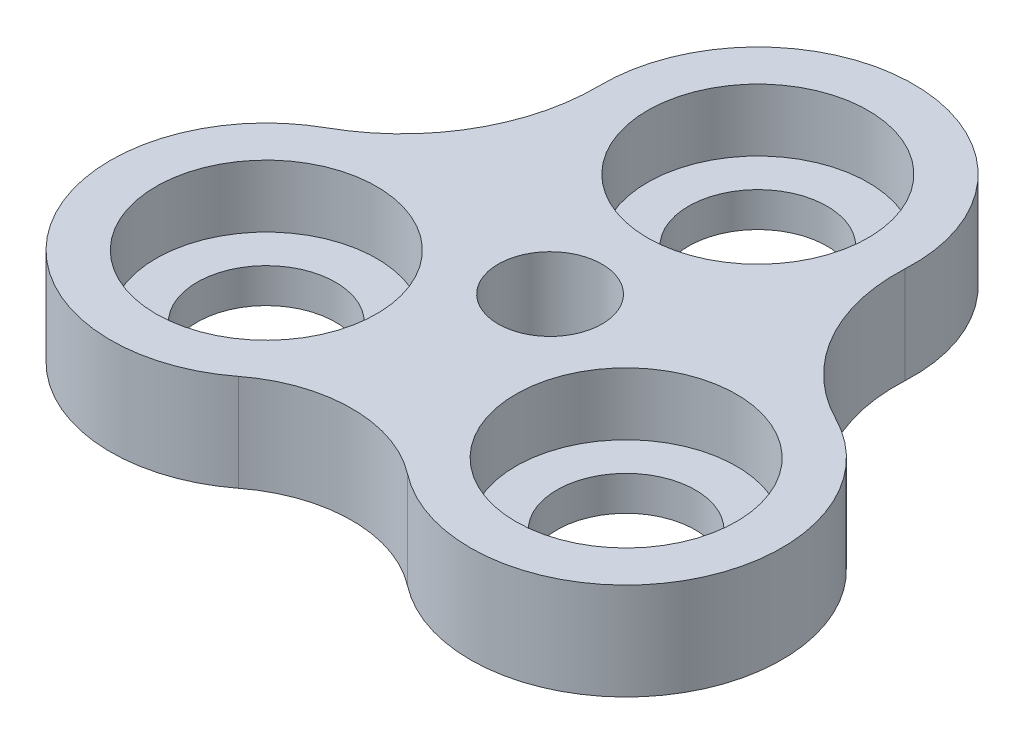
ISO-10303-21;
HEADER;
FILE_DESCRIPTION(('STEP AP214'),'2;1');
FILE_NAME('part.step','',(''),(''),'','','');
FILE_SCHEMA(('AUTOMOTIVE_DESIGN { 1 0 10303 214 1 1 1 1 }'));
ENDSEC;
DATA;
#1=APPLICATION_CONTEXT('core data for automotive mechanical design processes');
#2=APPLICATION_PROTOCOL_DEFINITION('international standard','automotive_design',2000,#1);
#3=PRODUCT_CONTEXT('',#1,'mechanical');
#4=PRODUCT('Part','Part','',(#3));
#5=PRODUCT_RELATED_PRODUCT_CATEGORY('part','',(#4));
#6=PRODUCT_DEFINITION_FORMATION('','',#4);
#7=PRODUCT_DEFINITION_CONTEXT('part definition',#1,'design');
#8=PRODUCT_DEFINITION('design','',#6,#7);
#9=PRODUCT_DEFINITION_SHAPE('','',#8);
#10=(LENGTH_UNIT() NAMED_UNIT(*) SI_UNIT(.MILLI.,.METRE.));
#11=(NAMED_UNIT(*) PLANE_ANGLE_UNIT() SI_UNIT($,.RADIAN.));
#12=(NAMED_UNIT(*) SI_UNIT($,.STERADIAN.) SOLID_ANGLE_UNIT());
#13=UNCERTAINTY_MEASURE_WITH_UNIT(LENGTH_MEASURE(1.E-05),#10,'distance_accuracy_value','');
#14=(GEOMETRIC_REPRESENTATION_CONTEXT(3) GLOBAL_UNCERTAINTY_ASSIGNED_CONTEXT((#13)) GLOBAL_UNIT_ASSIGNED_CONTEXT((#10,
#11,#12)) REPRESENTATION_CONTEXT('',''));
#15=CARTESIAN_POINT('',(0.,0.,0.));
#16=DIRECTION('',(0.,0.,1.));
#17=DIRECTION('',(1.,0.,0.));
#18=AXIS2_PLACEMENT_3D('',#15,#16,#17);
#19=CARTESIAN_POINT('',(-10.3923048454133,5.6,6.00000000000001));
#20=DIRECTION('',(0.,-1.,0.));
#21=DIRECTION('',(0.,0.,-1.));
#22=AXIS2_PLACEMENT_3D('',#19,#20,#21);
#23=CYLINDRICAL_SURFACE('',#22,9.);
#24=CARTESIAN_POINT('',(-10.3923048454133,0.,6.00000000000001));
#25=DIRECTION('',(0.,1.,0.));
#26=DIRECTION('',(0.,0.,1.));
#27=AXIS2_PLACEMENT_3D('',#24,#25,#26);
#28=CIRCLE('',#27,9.);
#29=CARTESIAN_POINT('',(-14.7758891564992,0.,-1.86029188946573));
#30=VERTEX_POINT('',#29);
#31=CARTESIAN_POINT('',(-4.88334112766204,0.,13.116973988747));
#32=VERTEX_POINT('',#31);
#33=EDGE_CURVE('E124',#30,#32,#28,.T.);
#34=ORIENTED_EDGE('',*,*,#33,.T.);
#35=DIRECTION('',(0.,-1.,0.));
#36=VECTOR('',#35,1.);
#37=CARTESIAN_POINT('',(-4.88334112766204,5.6,13.116973988747));
#38=LINE('',#37,#36);
#39=CARTESIAN_POINT('',(-4.88334112766204,5.6,13.116973988747));
#40=VERTEX_POINT('',#39);
#41=EDGE_CURVE('E11',#40,#32,#38,.T.);
#42=ORIENTED_EDGE('',*,*,#41,.F.);
#43=CARTESIAN_POINT('',(-10.3923048454133,5.6,6.00000000000001));
#44=DIRECTION('',(0.,1.,0.));
#45=DIRECTION('',(0.,0.,1.));
#46=AXIS2_PLACEMENT_3D('',#43,#44,#45);
#47=CIRCLE('',#46,9.);
#48=CARTESIAN_POINT('',(-14.7758891564992,5.6,-1.86029188946573));
#49=VERTEX_POINT('',#48);
#50=EDGE_CURVE('E331',#49,#40,#47,.T.);
#51=ORIENTED_EDGE('',*,*,#50,.F.);
#52=DIRECTION('',(0.,-1.,0.));
#53=VECTOR('',#52,1.);
#54=CARTESIAN_POINT('',(-14.7758891564992,5.6,-1.86029188946573));
#55=LINE('',#54,#53);
#56=EDGE_CURVE('E52',#49,#30,#55,.T.);
#57=ORIENTED_EDGE('',*,*,#56,.T.);
#58=EDGE_LOOP('',(#34,#42,#51,#57));
#59=FACE_BOUND('',#58,.T.);
#60=ADVANCED_FACE('F35',(#59),#23,.T.);
#61=CARTESIAN_POINT('',(0.,5.6,19.4257125400213));
#62=DIRECTION('',(0.,-1.,0.));
#63=DIRECTION('',(0.,0.,-1.));
#64=AXIS2_PLACEMENT_3D('',#61,#62,#63);
#65=CYLINDRICAL_SURFACE('',#64,7.97791969610194);
#66=CARTESIAN_POINT('',(0.,0.,19.4257125400213));
#67=DIRECTION('',(0.,1.,0.));
#68=DIRECTION('',(0.,0.,1.));
#69=AXIS2_PLACEMENT_3D('',#66,#67,#68);
#70=CIRCLE('',#69,7.97791969610194);
#71=CARTESIAN_POINT('',(4.88334112766205,0.,13.1169739887469));
#72=VERTEX_POINT('',#71);
#73=EDGE_CURVE('E127',#32,#72,#70,.F.);
#74=ORIENTED_EDGE('',*,*,#73,.T.);
#75=DIRECTION('',(0.,-1.,0.));
#76=VECTOR('',#75,1.);
#77=CARTESIAN_POINT('',(4.88334112766205,5.6,13.1169739887469));
#78=LINE('',#77,#76);
#79=CARTESIAN_POINT('',(4.88334112766205,5.6,13.1169739887469));
#80=VERTEX_POINT('',#79);
#81=EDGE_CURVE('E44',#80,#72,#78,.T.);
#82=ORIENTED_EDGE('',*,*,#81,.F.);
#83=CARTESIAN_POINT('',(0.,5.6,19.4257125400213));
#84=DIRECTION('',(0.,1.,0.));
#85=DIRECTION('',(0.,0.,1.));
#86=AXIS2_PLACEMENT_3D('',#83,#84,#85);
#87=CIRCLE('',#86,7.97791969610194);
#88=EDGE_CURVE('E85',#40,#80,#87,.F.);
#89=ORIENTED_EDGE('',*,*,#88,.F.);
#90=ORIENTED_EDGE('',*,*,#41,.T.);
#91=EDGE_LOOP('',(#74,#82,#89,#90));
#92=FACE_BOUND('',#91,.T.);
#93=ADVANCED_FACE('F160',(#92),#65,.F.);
#94=CARTESIAN_POINT('',(10.3923048454133,5.6,6.));
#95=DIRECTION('',(0.,-1.,0.));
#96=DIRECTION('',(0.,0.,-1.));
#97=AXIS2_PLACEMENT_3D('',#94,#95,#96);
#98=CYLINDRICAL_SURFACE('',#97,9.);
#99=CARTESIAN_POINT('',(10.3923048454133,0.,6.));
#100=DIRECTION('',(0.,1.,0.));
#101=DIRECTION('',(0.,0.,1.));
#102=AXIS2_PLACEMENT_3D('',#99,#100,#101);
#103=CIRCLE('',#102,9.);
#104=CARTESIAN_POINT('',(14.4775848258601,0.,-2.01938198874204));
#105=VERTEX_POINT('',#104);
#106=EDGE_CURVE('E129',#72,#105,#103,.T.);
#107=ORIENTED_EDGE('',*,*,#106,.T.);
#108=DIRECTION('',(0.,-1.,0.));
#109=VECTOR('',#108,1.);
#110=CARTESIAN_POINT('',(14.4775848258601,5.6,-2.01938198874204));
#111=LINE('',#110,#109);
#112=CARTESIAN_POINT('',(14.4775848258601,5.6,-2.01938198874204));
#113=VERTEX_POINT('',#112);
#114=EDGE_CURVE('E104',#113,#105,#111,.T.);
#115=ORIENTED_EDGE('',*,*,#114,.F.);
#116=CARTESIAN_POINT('',(10.3923048454133,5.6,6.));
#117=DIRECTION('',(0.,1.,0.));
#118=DIRECTION('',(0.,0.,1.));
#119=AXIS2_PLACEMENT_3D('',#116,#117,#118);
#120=CIRCLE('',#119,9.);
#121=EDGE_CURVE('E114',#80,#113,#120,.T.);
#122=ORIENTED_EDGE('',*,*,#121,.F.);
#123=ORIENTED_EDGE('',*,*,#81,.T.);
#124=EDGE_LOOP('',(#107,#115,#122,#123));
#125=FACE_BOUND('',#124,.T.);
#126=ADVANCED_FACE('F144',(#125),#98,.T.);
#127=CARTESIAN_POINT('',(19.0525366986451,5.6,-10.999987191708));
#128=DIRECTION('',(0.,-1.,0.));
#129=DIRECTION('',(0.,0.,-1.));
#130=AXIS2_PLACEMENT_3D('',#127,#128,#129);
#131=CYLINDRICAL_SURFACE('',#130,10.0787625455627);
#132=CARTESIAN_POINT('',(19.0525366986451,0.,-10.999987191708));
#133=DIRECTION('',(0.,1.,0.));
#134=DIRECTION('',(0.,0.,1.));
#135=AXIS2_PLACEMENT_3D('',#132,#133,#134);
#136=CIRCLE('',#135,10.0787625455627);
#137=CARTESIAN_POINT('',(8.9876285151254,0.,-11.5282652502679));
#138=VERTEX_POINT('',#137);
#139=EDGE_CURVE('E101',#138,#105,#136,.T.);
#140=ORIENTED_EDGE('',*,*,#139,.F.);
#141=DIRECTION('',(0.,-1.,0.));
#142=VECTOR('',#141,1.);
#143=CARTESIAN_POINT('',(8.9876285151254,5.6,-11.5282652502679));
#144=LINE('',#143,#142);
#145=CARTESIAN_POINT('',(8.9876285151254,5.6,-11.5282652502679));
#146=VERTEX_POINT('',#145);
#147=EDGE_CURVE('E95',#146,#138,#144,.T.);
#148=ORIENTED_EDGE('',*,*,#147,.F.);
#149=CARTESIAN_POINT('',(19.0525366986451,5.6,-10.999987191708));
#150=DIRECTION('',(0.,1.,0.));
#151=DIRECTION('',(0.,0.,1.));
#152=AXIS2_PLACEMENT_3D('',#149,#150,#151);
#153=CIRCLE('',#152,10.0787625455627);
#154=EDGE_CURVE('E99',#146,#113,#153,.T.);
#155=ORIENTED_EDGE('',*,*,#154,.T.);
#156=ORIENTED_EDGE('',*,*,#114,.T.);
#157=EDGE_LOOP('',(#140,#148,#155,#156));
#158=FACE_BOUND('',#157,.T.);
#159=ADVANCED_FACE('F97',(#158),#131,.F.);
#160=CARTESIAN_POINT('',(0.,5.6,-12.));
#161=DIRECTION('',(0.,-1.,0.));
#162=DIRECTION('',(0.,0.,-1.));
#163=AXIS2_PLACEMENT_3D('',#160,#161,#162);
#164=CYLINDRICAL_SURFACE('',#163,9.);
#165=CARTESIAN_POINT('',(0.,0.,-12.));
#166=DIRECTION('',(0.,1.,0.));
#167=DIRECTION('',(0.,0.,1.));
#168=AXIS2_PLACEMENT_3D('',#165,#166,#167);
#169=CIRCLE('',#168,9.);
#170=CARTESIAN_POINT('',(-8.9990046129811,0.,-11.8661494282985));
#171=VERTEX_POINT('',#170);
#172=EDGE_CURVE('E133',#138,#171,#169,.T.);
#173=ORIENTED_EDGE('',*,*,#172,.T.);
#174=DIRECTION('',(0.,-1.,0.));
#175=VECTOR('',#174,1.);
#176=CARTESIAN_POINT('',(-8.9990046129811,5.6,-11.8661494282985));
#177=LINE('',#176,#175);
#178=CARTESIAN_POINT('',(-8.9990046129811,5.6,-11.8661494282985));
#179=VERTEX_POINT('',#178);
#180=EDGE_CURVE('E73',#179,#171,#177,.T.);
#181=ORIENTED_EDGE('',*,*,#180,.F.);
#182=CARTESIAN_POINT('',(0.,5.6,-12.));
#183=DIRECTION('',(0.,1.,0.));
#184=DIRECTION('',(0.,0.,1.));
#185=AXIS2_PLACEMENT_3D('',#182,#183,#184);
#186=CIRCLE('',#185,9.);
#187=EDGE_CURVE('E106',#146,#179,#186,.T.);
#188=ORIENTED_EDGE('',*,*,#187,.F.);
#189=ORIENTED_EDGE('',*,*,#147,.T.);
#190=EDGE_LOOP('',(#173,#181,#188,#189));
#191=FACE_BOUND('',#190,.T.);
#192=ADVANCED_FACE('F107',(#191),#164,.T.);
#193=CARTESIAN_POINT('',(0.,5.6,0.));
#194=DIRECTION('',(0.,-1.,0.));
#195=DIRECTION('',(0.,0.,-1.));
#196=AXIS2_PLACEMENT_3D('',#193,#194,#195);
#197=CYLINDRICAL_SURFACE('',#196,3.);
#198=CARTESIAN_POINT('',(0.,5.6,0.));
#199=DIRECTION('',(0.,1.,0.));
#200=DIRECTION('',(0.,0.,1.));
#201=AXIS2_PLACEMENT_3D('',#198,#199,#200);
#202=CIRCLE('',#201,3.);
#203=CARTESIAN_POINT('',(0.,5.6,3.));
#204=VERTEX_POINT('',#203);
#205=EDGE_CURVE('E138',#204,#204,#202,.T.);
#206=ORIENTED_EDGE('',*,*,#205,.T.);
#207=EDGE_LOOP('',(#206));
#208=FACE_BOUND('',#207,.T.);
#209=CARTESIAN_POINT('',(0.,0.,0.));
#210=DIRECTION('',(0.,1.,0.));
#211=DIRECTION('',(0.,0.,1.));
#212=AXIS2_PLACEMENT_3D('',#209,#210,#211);
#213=CIRCLE('',#212,3.);
#214=CARTESIAN_POINT('',(0.,0.,3.));
#215=VERTEX_POINT('',#214);
#216=EDGE_CURVE('E121',#215,#215,#213,.T.);
#217=ORIENTED_EDGE('',*,*,#216,.F.);
#218=EDGE_LOOP('',(#217));
#219=FACE_BOUND('',#218,.T.);
#220=ADVANCED_FACE('F37',(#208,#219),#197,.F.);
#221=CARTESIAN_POINT('',(-20.262596497437,5.6,-11.698615542276));
#222=DIRECTION('',(0.,-1.,0.));
#223=DIRECTION('',(0.,0.,-1.));
#224=AXIS2_PLACEMENT_3D('',#221,#222,#223);
#225=CYLINDRICAL_SURFACE('',#224,11.2648377592643);
#226=CARTESIAN_POINT('',(-20.262596497437,0.,-11.698615542276));
#227=DIRECTION('',(0.,1.,0.));
#228=DIRECTION('',(0.,0.,1.));
#229=AXIS2_PLACEMENT_3D('',#226,#227,#228);
#230=CIRCLE('',#229,11.2648377592643);
#231=EDGE_CURVE('E135',#30,#171,#230,.T.);
#232=ORIENTED_EDGE('',*,*,#231,.F.);
#233=ORIENTED_EDGE('',*,*,#56,.F.);
#234=CARTESIAN_POINT('',(-20.262596497437,5.6,-11.698615542276));
#235=DIRECTION('',(0.,1.,0.));
#236=DIRECTION('',(0.,0.,1.));
#237=AXIS2_PLACEMENT_3D('',#234,#235,#236);
#238=CIRCLE('',#237,11.2648377592643);
#239=EDGE_CURVE('E110',#49,#179,#238,.T.);
#240=ORIENTED_EDGE('',*,*,#239,.T.);
#241=ORIENTED_EDGE('',*,*,#180,.T.);
#242=EDGE_LOOP('',(#232,#233,#240,#241));
#243=FACE_BOUND('',#242,.T.);
#244=ADVANCED_FACE('F147',(#243),#225,.F.);
#245=CARTESIAN_POINT('',(0.,5.6,0.));
#246=DIRECTION('',(0.,1.,0.));
#247=DIRECTION('',(0.,0.,1.));
#248=AXIS2_PLACEMENT_3D('',#245,#246,#247);
#249=PLANE('',#248);
#250=CARTESIAN_POINT('',(10.3923048454133,5.6,6.));
#251=DIRECTION('',(0.,1.,0.));
#252=DIRECTION('',(0.,0.,1.));
#253=AXIS2_PLACEMENT_3D('',#250,#251,#252);
#254=CIRCLE('',#253,6.375);
#255=CARTESIAN_POINT('',(10.3923048454133,5.6,12.375));
#256=VERTEX_POINT('',#255);
#257=EDGE_CURVE('E310',#256,#256,#254,.T.);
#258=ORIENTED_EDGE('',*,*,#257,.F.);
#259=EDGE_LOOP('',(#258));
#260=FACE_BOUND('',#259,.T.);
#261=CARTESIAN_POINT('',(0.,5.6,-12.));
#262=DIRECTION('',(0.,1.,0.));
#263=DIRECTION('',(0.,0.,1.));
#264=AXIS2_PLACEMENT_3D('',#261,#262,#263);
#265=CIRCLE('',#264,6.375);
#266=CARTESIAN_POINT('',(0.,5.6,-5.625));
#267=VERTEX_POINT('',#266);
#268=EDGE_CURVE('E316',#267,#267,#265,.T.);
#269=ORIENTED_EDGE('',*,*,#268,.F.);
#270=EDGE_LOOP('',(#269));
#271=FACE_BOUND('',#270,.T.);
#272=CARTESIAN_POINT('',(-10.3923048454133,5.6,6.00000000000001));
#273=DIRECTION('',(0.,1.,0.));
#274=DIRECTION('',(0.,0.,1.));
#275=AXIS2_PLACEMENT_3D('',#272,#273,#274);
#276=CIRCLE('',#275,6.375);
#277=CARTESIAN_POINT('',(-10.3923048454133,5.6,12.375));
#278=VERTEX_POINT('',#277);
#279=EDGE_CURVE('E322',#278,#278,#276,.T.);
#280=ORIENTED_EDGE('',*,*,#279,.F.);
#281=EDGE_LOOP('',(#280));
#282=FACE_BOUND('',#281,.T.);
#283=ORIENTED_EDGE('',*,*,#205,.F.);
#284=EDGE_LOOP('',(#283));
#285=FACE_BOUND('',#284,.T.);
#286=ORIENTED_EDGE('',*,*,#50,.T.);
#287=ORIENTED_EDGE('',*,*,#88,.T.);
#288=ORIENTED_EDGE('',*,*,#121,.T.);
#289=ORIENTED_EDGE('',*,*,#154,.F.);
#290=ORIENTED_EDGE('',*,*,#187,.T.);
#291=ORIENTED_EDGE('',*,*,#239,.F.);
#292=EDGE_LOOP('',(#286,#287,#288,#289,#290,#291));
#293=FACE_BOUND('',#292,.T.);
#294=ADVANCED_FACE('F112',(#260,#271,#282,#285,#293),#249,.T.);
#295=CARTESIAN_POINT('',(0.,0.,0.));
#296=DIRECTION('',(0.,1.,0.));
#297=DIRECTION('',(0.,0.,1.));
#298=AXIS2_PLACEMENT_3D('',#295,#296,#297);
#299=PLANE('',#298);
#300=CARTESIAN_POINT('',(10.3923048454133,0.,6.));
#301=DIRECTION('',(0.,1.,0.));
#302=DIRECTION('',(0.,0.,1.));
#303=AXIS2_PLACEMENT_3D('',#300,#301,#302);
#304=CIRCLE('',#303,4.);
#305=CARTESIAN_POINT('',(10.3923048454133,0.,10.));
#306=VERTEX_POINT('',#305);
#307=EDGE_CURVE('E293',#306,#306,#304,.T.);
#308=ORIENTED_EDGE('',*,*,#307,.T.);
#309=EDGE_LOOP('',(#308));
#310=FACE_BOUND('',#309,.T.);
#311=CARTESIAN_POINT('',(0.,0.,-12.));
#312=DIRECTION('',(0.,1.,0.));
#313=DIRECTION('',(0.,0.,1.));
#314=AXIS2_PLACEMENT_3D('',#311,#312,#313);
#315=CIRCLE('',#314,4.);
#316=CARTESIAN_POINT('',(0.,0.,-8.));
#317=VERTEX_POINT('',#316);
#318=EDGE_CURVE('E301',#317,#317,#315,.T.);
#319=ORIENTED_EDGE('',*,*,#318,.T.);
#320=EDGE_LOOP('',(#319));
#321=FACE_BOUND('',#320,.T.);
#322=CARTESIAN_POINT('',(-10.3923048454133,0.,6.00000000000001));
#323=DIRECTION('',(0.,1.,0.));
#324=DIRECTION('',(0.,0.,1.));
#325=AXIS2_PLACEMENT_3D('',#322,#323,#324);
#326=CIRCLE('',#325,4.);
#327=CARTESIAN_POINT('',(-10.3923048454133,0.,10.));
#328=VERTEX_POINT('',#327);
#329=EDGE_CURVE('E307',#328,#328,#326,.T.);
#330=ORIENTED_EDGE('',*,*,#329,.T.);
#331=EDGE_LOOP('',(#330));
#332=FACE_BOUND('',#331,.T.);
#333=ORIENTED_EDGE('',*,*,#216,.T.);
#334=EDGE_LOOP('',(#333));
#335=FACE_BOUND('',#334,.T.);
#336=ORIENTED_EDGE('',*,*,#33,.F.);
#337=ORIENTED_EDGE('',*,*,#231,.T.);
#338=ORIENTED_EDGE('',*,*,#172,.F.);
#339=ORIENTED_EDGE('',*,*,#139,.T.);
#340=ORIENTED_EDGE('',*,*,#106,.F.);
#341=ORIENTED_EDGE('',*,*,#73,.F.);
#342=EDGE_LOOP('',(#336,#337,#338,#339,#340,#341));
#343=FACE_BOUND('',#342,.T.);
#344=ADVANCED_FACE('F146',(#310,#321,#332,#335,#343),#299,.F.);
#345=CARTESIAN_POINT('',(-10.3923048454133,2.,6.00000000000001));
#346=DIRECTION('',(0.,1.,0.));
#347=DIRECTION('',(0.,0.,1.));
#348=AXIS2_PLACEMENT_3D('',#345,#346,#347);
#349=CYLINDRICAL_SURFACE('',#348,6.375);
#350=CARTESIAN_POINT('',(-10.3923048454133,2.,6.00000000000001));
#351=DIRECTION('',(0.,1.,0.));
#352=DIRECTION('',(0.,0.,1.));
#353=AXIS2_PLACEMENT_3D('',#350,#351,#352);
#354=CIRCLE('',#353,6.375);
#355=CARTESIAN_POINT('',(-10.3923048454133,2.,12.375));
#356=VERTEX_POINT('',#355);
#357=EDGE_CURVE('E125',#356,#356,#354,.T.);
#358=ORIENTED_EDGE('',*,*,#357,.F.);
#359=EDGE_LOOP('',(#358));
#360=FACE_BOUND('',#359,.T.);
#361=ORIENTED_EDGE('',*,*,#279,.T.);
#362=EDGE_LOOP('',(#361));
#363=FACE_BOUND('',#362,.T.);
#364=ADVANCED_FACE('F195',(#360,#363),#349,.F.);
#365=CARTESIAN_POINT('',(-10.3923048454133,2.,6.00000000000001));
#366=DIRECTION('',(0.,1.,0.));
#367=DIRECTION('',(0.,0.,1.));
#368=AXIS2_PLACEMENT_3D('',#365,#366,#367);
#369=PLANE('',#368);
#370=CARTESIAN_POINT('',(-10.3923048454133,2.,6.00000000000001));
#371=DIRECTION('',(0.,1.,0.));
#372=DIRECTION('',(0.,0.,1.));
#373=AXIS2_PLACEMENT_3D('',#370,#371,#372);
#374=CIRCLE('',#373,4.);
#375=CARTESIAN_POINT('',(-10.3923048454133,2.,10.));
#376=VERTEX_POINT('',#375);
#377=EDGE_CURVE('E304',#376,#376,#374,.T.);
#378=ORIENTED_EDGE('',*,*,#377,.F.);
#379=EDGE_LOOP('',(#378));
#380=FACE_BOUND('',#379,.T.);
#381=ORIENTED_EDGE('',*,*,#357,.T.);
#382=EDGE_LOOP('',(#381));
#383=FACE_BOUND('',#382,.T.);
#384=ADVANCED_FACE('F200',(#380,#383),#369,.T.);
#385=CARTESIAN_POINT('',(0.,2.,-12.));
#386=DIRECTION('',(0.,1.,0.));
#387=DIRECTION('',(0.,0.,1.));
#388=AXIS2_PLACEMENT_3D('',#385,#386,#387);
#389=CYLINDRICAL_SURFACE('',#388,6.375);
#390=CARTESIAN_POINT('',(0.,2.,-12.));
#391=DIRECTION('',(0.,1.,0.));
#392=DIRECTION('',(0.,0.,1.));
#393=AXIS2_PLACEMENT_3D('',#390,#391,#392);
#394=CIRCLE('',#393,6.375);
#395=CARTESIAN_POINT('',(0.,2.,-5.625));
#396=VERTEX_POINT('',#395);
#397=EDGE_CURVE('E319',#396,#396,#394,.T.);
#398=ORIENTED_EDGE('',*,*,#397,.F.);
#399=EDGE_LOOP('',(#398));
#400=FACE_BOUND('',#399,.T.);
#401=ORIENTED_EDGE('',*,*,#268,.T.);
#402=EDGE_LOOP('',(#401));
#403=FACE_BOUND('',#402,.T.);
#404=ADVANCED_FACE('F208',(#400,#403),#389,.F.);
#405=CARTESIAN_POINT('',(0.,2.,-12.));
#406=DIRECTION('',(0.,1.,0.));
#407=DIRECTION('',(0.,0.,1.));
#408=AXIS2_PLACEMENT_3D('',#405,#406,#407);
#409=PLANE('',#408);
#410=CARTESIAN_POINT('',(0.,2.,-12.));
#411=DIRECTION('',(0.,1.,0.));
#412=DIRECTION('',(0.,0.,1.));
#413=AXIS2_PLACEMENT_3D('',#410,#411,#412);
#414=CIRCLE('',#413,4.);
#415=CARTESIAN_POINT('',(0.,2.,-8.));
#416=VERTEX_POINT('',#415);
#417=EDGE_CURVE('E298',#416,#416,#414,.T.);
#418=ORIENTED_EDGE('',*,*,#417,.F.);
#419=EDGE_LOOP('',(#418));
#420=FACE_BOUND('',#419,.T.);
#421=ORIENTED_EDGE('',*,*,#397,.T.);
#422=EDGE_LOOP('',(#421));
#423=FACE_BOUND('',#422,.T.);
#424=ADVANCED_FACE('F213',(#420,#423),#409,.T.);
#425=CARTESIAN_POINT('',(10.3923048454133,2.,6.));
#426=DIRECTION('',(0.,1.,0.));
#427=DIRECTION('',(0.,0.,1.));
#428=AXIS2_PLACEMENT_3D('',#425,#426,#427);
#429=CYLINDRICAL_SURFACE('',#428,6.375);
#430=CARTESIAN_POINT('',(10.3923048454133,2.,6.));
#431=DIRECTION('',(0.,1.,0.));
#432=DIRECTION('',(0.,0.,1.));
#433=AXIS2_PLACEMENT_3D('',#430,#431,#432);
#434=CIRCLE('',#433,6.375);
#435=CARTESIAN_POINT('',(10.3923048454133,2.,12.375));
#436=VERTEX_POINT('',#435);
#437=EDGE_CURVE('E313',#436,#436,#434,.T.);
#438=ORIENTED_EDGE('',*,*,#437,.F.);
#439=EDGE_LOOP('',(#438));
#440=FACE_BOUND('',#439,.T.);
#441=ORIENTED_EDGE('',*,*,#257,.T.);
#442=EDGE_LOOP('',(#441));
#443=FACE_BOUND('',#442,.T.);
#444=ADVANCED_FACE('F221',(#440,#443),#429,.F.);
#445=CARTESIAN_POINT('',(10.3923048454133,2.,6.));
#446=DIRECTION('',(0.,1.,0.));
#447=DIRECTION('',(0.,0.,1.));
#448=AXIS2_PLACEMENT_3D('',#445,#446,#447);
#449=PLANE('',#448);
#450=CARTESIAN_POINT('',(10.3923048454133,2.,6.));
#451=DIRECTION('',(0.,1.,0.));
#452=DIRECTION('',(0.,0.,1.));
#453=AXIS2_PLACEMENT_3D('',#450,#451,#452);
#454=CIRCLE('',#453,4.);
#455=CARTESIAN_POINT('',(10.3923048454133,2.,10.));
#456=VERTEX_POINT('',#455);
#457=EDGE_CURVE('E296',#456,#456,#454,.T.);
#458=ORIENTED_EDGE('',*,*,#457,.F.);
#459=EDGE_LOOP('',(#458));
#460=FACE_BOUND('',#459,.T.);
#461=ORIENTED_EDGE('',*,*,#437,.T.);
#462=EDGE_LOOP('',(#461));
#463=FACE_BOUND('',#462,.T.);
#464=ADVANCED_FACE('F226',(#460,#463),#449,.T.);
#465=CARTESIAN_POINT('',(-10.3923048454133,0.,6.00000000000001));
#466=DIRECTION('',(0.,1.,0.));
#467=DIRECTION('',(0.,0.,1.));
#468=AXIS2_PLACEMENT_3D('',#465,#466,#467);
#469=CYLINDRICAL_SURFACE('',#468,4.);
#470=ORIENTED_EDGE('',*,*,#329,.F.);
#471=EDGE_LOOP('',(#470));
#472=FACE_BOUND('',#471,.T.);
#473=ORIENTED_EDGE('',*,*,#377,.T.);
#474=EDGE_LOOP('',(#473));
#475=FACE_BOUND('',#474,.T.);
#476=ADVANCED_FACE('F256',(#472,#475),#469,.F.);
#477=CARTESIAN_POINT('',(0.,0.,-12.));
#478=DIRECTION('',(0.,1.,0.));
#479=DIRECTION('',(0.,0.,1.));
#480=AXIS2_PLACEMENT_3D('',#477,#478,#479);
#481=CYLINDRICAL_SURFACE('',#480,4.);
#482=ORIENTED_EDGE('',*,*,#318,.F.);
#483=EDGE_LOOP('',(#482));
#484=FACE_BOUND('',#483,.T.);
#485=ORIENTED_EDGE('',*,*,#417,.T.);
#486=EDGE_LOOP('',(#485));
#487=FACE_BOUND('',#486,.T.);
#488=ADVANCED_FACE('F266',(#484,#487),#481,.F.);
#489=CARTESIAN_POINT('',(10.3923048454133,0.,6.));
#490=DIRECTION('',(0.,1.,0.));
#491=DIRECTION('',(0.,0.,1.));
#492=AXIS2_PLACEMENT_3D('',#489,#490,#491);
#493=CYLINDRICAL_SURFACE('',#492,4.);
#494=ORIENTED_EDGE('',*,*,#307,.F.);
#495=EDGE_LOOP('',(#494));
#496=FACE_BOUND('',#495,.T.);
#497=ORIENTED_EDGE('',*,*,#457,.T.);
#498=EDGE_LOOP('',(#497));
#499=FACE_BOUND('',#498,.T.);
#500=ADVANCED_FACE('F276',(#496,#499),#493,.F.);
#501=CLOSED_SHELL('',(#60,#93,#126,#159,#192,#220,#244,#294,#344,#364,#384,#404,#424,#444,#464,
#476,#488,#500));
#502=MANIFOLD_SOLID_BREP('B2',#501);
#503=ADVANCED_BREP_SHAPE_REPRESENTATION('',(#18,#502),#14);
#504=SHAPE_DEFINITION_REPRESENTATION(#9,#503);
ENDSEC;
END-ISO-10303-21;
